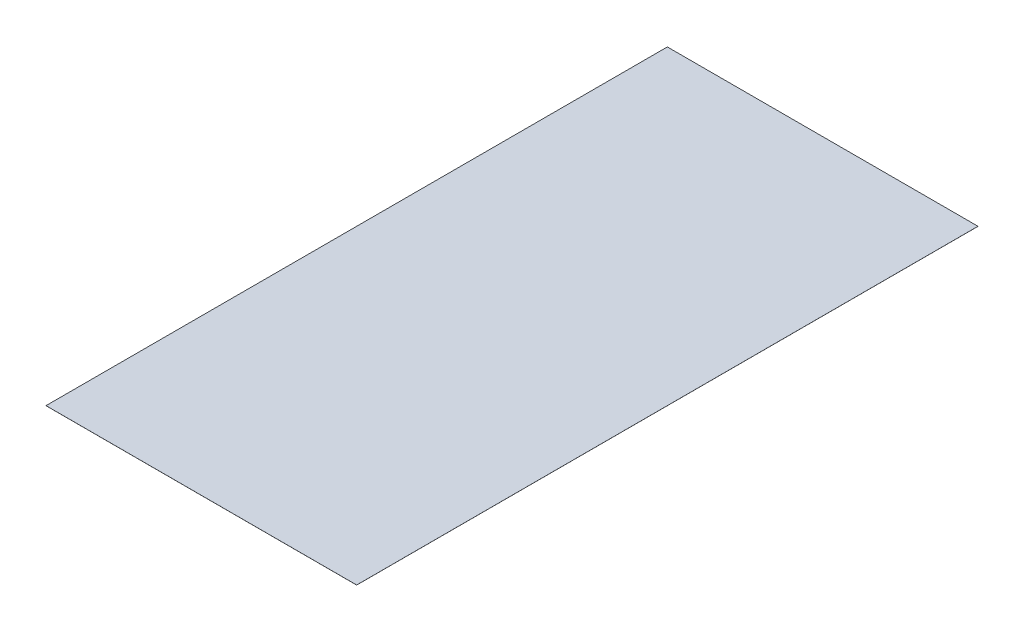
ISO-10303-21;
HEADER;
FILE_DESCRIPTION(('STEP AP214'),'2;1');
FILE_NAME('part.step','',(''),(''),'','','');
FILE_SCHEMA(('AUTOMOTIVE_DESIGN { 1 0 10303 214 1 1 1 1 }'));
ENDSEC;
DATA;
#1=APPLICATION_CONTEXT('core data for automotive mechanical design processes');
#2=APPLICATION_PROTOCOL_DEFINITION('international standard','automotive_design',2000,#1);
#3=PRODUCT_CONTEXT('',#1,'mechanical');
#4=PRODUCT('Part','Part','',(#3));
#5=PRODUCT_RELATED_PRODUCT_CATEGORY('part','',(#4));
#6=PRODUCT_DEFINITION_FORMATION('','',#4);
#7=PRODUCT_DEFINITION_CONTEXT('part definition',#1,'design');
#8=PRODUCT_DEFINITION('design','',#6,#7);
#9=PRODUCT_DEFINITION_SHAPE('','',#8);
#10=(LENGTH_UNIT() NAMED_UNIT(*) SI_UNIT(.MILLI.,.METRE.));
#11=(NAMED_UNIT(*) PLANE_ANGLE_UNIT() SI_UNIT($,.RADIAN.));
#12=(NAMED_UNIT(*) SI_UNIT($,.STERADIAN.) SOLID_ANGLE_UNIT());
#13=UNCERTAINTY_MEASURE_WITH_UNIT(LENGTH_MEASURE(1.E-05),#10,'distance_accuracy_value','');
#14=(GEOMETRIC_REPRESENTATION_CONTEXT(3) GLOBAL_UNCERTAINTY_ASSIGNED_CONTEXT((#13)) GLOBAL_UNIT_ASSIGNED_CONTEXT((#10,
#11,#12)) REPRESENTATION_CONTEXT('',''));
#15=CARTESIAN_POINT('',(0.,0.,0.));
#16=DIRECTION('',(0.,0.,1.));
#17=DIRECTION('',(1.,0.,0.));
#18=AXIS2_PLACEMENT_3D('',#15,#16,#17);
#19=CARTESIAN_POINT('',(2500.,1.,5000.));
#20=DIRECTION('',(-1.,0.,0.));
#21=DIRECTION('',(0.,0.,1.));
#22=AXIS2_PLACEMENT_3D('',#19,#20,#21);
#23=PLANE('',#22);
#24=DIRECTION('',(0.,0.,-1.));
#25=VECTOR('',#24,1.);
#26=CARTESIAN_POINT('',(2500.,0.,5000.));
#27=LINE('',#26,#25);
#28=CARTESIAN_POINT('',(2500.,0.,5000.));
#29=VERTEX_POINT('',#28);
#30=CARTESIAN_POINT('',(2500.,0.,-5000.));
#31=VERTEX_POINT('',#30);
#32=EDGE_CURVE('E98',#29,#31,#27,.T.);
#33=ORIENTED_EDGE('',*,*,#32,.T.);
#34=DIRECTION('',(0.,-1.,0.));
#35=VECTOR('',#34,1.);
#36=CARTESIAN_POINT('',(2500.,1.,-5000.));
#37=LINE('',#36,#35);
#38=CARTESIAN_POINT('',(2500.,1.,-5000.));
#39=VERTEX_POINT('',#38);
#40=EDGE_CURVE('E11',#39,#31,#37,.T.);
#41=ORIENTED_EDGE('',*,*,#40,.F.);
#42=DIRECTION('',(0.,0.,-1.));
#43=VECTOR('',#42,1.);
#44=CARTESIAN_POINT('',(2500.,1.,5000.));
#45=LINE('',#44,#43);
#46=CARTESIAN_POINT('',(2500.,1.,5000.));
#47=VERTEX_POINT('',#46);
#48=EDGE_CURVE('E86',#47,#39,#45,.T.);
#49=ORIENTED_EDGE('',*,*,#48,.F.);
#50=DIRECTION('',(0.,-1.,0.));
#51=VECTOR('',#50,1.);
#52=CARTESIAN_POINT('',(2500.,1.,5000.));
#53=LINE('',#52,#51);
#54=EDGE_CURVE('E94',#47,#29,#53,.T.);
#55=ORIENTED_EDGE('',*,*,#54,.T.);
#56=EDGE_LOOP('',(#33,#41,#49,#55));
#57=FACE_BOUND('',#56,.T.);
#58=ADVANCED_FACE('F35',(#57),#23,.F.);
#59=CARTESIAN_POINT('',(-2500.,1.,-5000.));
#60=DIRECTION('',(0.,0.,1.));
#61=DIRECTION('',(1.,0.,0.));
#62=AXIS2_PLACEMENT_3D('',#59,#60,#61);
#63=PLANE('',#62);
#64=DIRECTION('',(-1.,0.,0.));
#65=VECTOR('',#64,1.);
#66=CARTESIAN_POINT('',(-2500.,0.,-5000.));
#67=LINE('',#66,#65);
#68=CARTESIAN_POINT('',(-2500.,0.,-5000.));
#69=VERTEX_POINT('',#68);
#70=EDGE_CURVE('E90',#31,#69,#67,.T.);
#71=ORIENTED_EDGE('',*,*,#70,.T.);
#72=DIRECTION('',(0.,-1.,0.));
#73=VECTOR('',#72,1.);
#74=CARTESIAN_POINT('',(-2500.,1.,-5000.));
#75=LINE('',#74,#73);
#76=CARTESIAN_POINT('',(-2500.,1.,-5000.));
#77=VERTEX_POINT('',#76);
#78=EDGE_CURVE('E43',#77,#69,#75,.T.);
#79=ORIENTED_EDGE('',*,*,#78,.F.);
#80=DIRECTION('',(-1.,0.,0.));
#81=VECTOR('',#80,1.);
#82=CARTESIAN_POINT('',(-2500.,1.,-5000.));
#83=LINE('',#82,#81);
#84=EDGE_CURVE('E81',#39,#77,#83,.T.);
#85=ORIENTED_EDGE('',*,*,#84,.F.);
#86=ORIENTED_EDGE('',*,*,#40,.T.);
#87=EDGE_LOOP('',(#71,#79,#85,#86));
#88=FACE_BOUND('',#87,.T.);
#89=ADVANCED_FACE('F89',(#88),#63,.F.);
#90=CARTESIAN_POINT('',(-2500.,1.,5000.));
#91=DIRECTION('',(1.,0.,0.));
#92=DIRECTION('',(0.,0.,-1.));
#93=AXIS2_PLACEMENT_3D('',#90,#91,#92);
#94=PLANE('',#93);
#95=DIRECTION('',(0.,0.,1.));
#96=VECTOR('',#95,1.);
#97=CARTESIAN_POINT('',(-2500.,0.,5000.));
#98=LINE('',#97,#96);
#99=CARTESIAN_POINT('',(-2500.,0.,5000.));
#100=VERTEX_POINT('',#99);
#101=EDGE_CURVE('E68',#69,#100,#98,.T.);
#102=ORIENTED_EDGE('',*,*,#101,.T.);
#103=DIRECTION('',(0.,-1.,0.));
#104=VECTOR('',#103,1.);
#105=CARTESIAN_POINT('',(-2500.,1.,5000.));
#106=LINE('',#105,#104);
#107=CARTESIAN_POINT('',(-2500.,1.,5000.));
#108=VERTEX_POINT('',#107);
#109=EDGE_CURVE('E91',#108,#100,#106,.T.);
#110=ORIENTED_EDGE('',*,*,#109,.F.);
#111=DIRECTION('',(0.,0.,1.));
#112=VECTOR('',#111,1.);
#113=CARTESIAN_POINT('',(-2500.,1.,5000.));
#114=LINE('',#113,#112);
#115=EDGE_CURVE('E84',#77,#108,#114,.T.);
#116=ORIENTED_EDGE('',*,*,#115,.F.);
#117=ORIENTED_EDGE('',*,*,#78,.T.);
#118=EDGE_LOOP('',(#102,#110,#116,#117));
#119=FACE_BOUND('',#118,.T.);
#120=ADVANCED_FACE('F92',(#119),#94,.F.);
#121=CARTESIAN_POINT('',(-2500.,1.,5000.));
#122=DIRECTION('',(0.,0.,-1.));
#123=DIRECTION('',(-1.,0.,0.));
#124=AXIS2_PLACEMENT_3D('',#121,#122,#123);
#125=PLANE('',#124);
#126=DIRECTION('',(1.,0.,0.));
#127=VECTOR('',#126,1.);
#128=CARTESIAN_POINT('',(-2500.,0.,5000.));
#129=LINE('',#128,#127);
#130=EDGE_CURVE('E74',#100,#29,#129,.T.);
#131=ORIENTED_EDGE('',*,*,#130,.T.);
#132=ORIENTED_EDGE('',*,*,#54,.F.);
#133=DIRECTION('',(1.,0.,0.));
#134=VECTOR('',#133,1.);
#135=CARTESIAN_POINT('',(-2500.,1.,5000.));
#136=LINE('',#135,#134);
#137=EDGE_CURVE('E51',#108,#47,#136,.T.);
#138=ORIENTED_EDGE('',*,*,#137,.F.);
#139=ORIENTED_EDGE('',*,*,#109,.T.);
#140=EDGE_LOOP('',(#131,#132,#138,#139));
#141=FACE_BOUND('',#140,.T.);
#142=ADVANCED_FACE('F105',(#141),#125,.F.);
#143=CARTESIAN_POINT('',(0.,1.,0.));
#144=DIRECTION('',(0.,-1.,0.));
#145=DIRECTION('',(0.,0.,-1.));
#146=AXIS2_PLACEMENT_3D('',#143,#144,#145);
#147=PLANE('',#146);
#148=ORIENTED_EDGE('',*,*,#48,.T.);
#149=ORIENTED_EDGE('',*,*,#84,.T.);
#150=ORIENTED_EDGE('',*,*,#115,.T.);
#151=ORIENTED_EDGE('',*,*,#137,.T.);
#152=EDGE_LOOP('',(#148,#149,#150,#151));
#153=FACE_BOUND('',#152,.T.);
#154=ADVANCED_FACE('F82',(#153),#147,.F.);
#155=CARTESIAN_POINT('',(0.,0.,0.));
#156=DIRECTION('',(0.,-1.,0.));
#157=DIRECTION('',(0.,0.,-1.));
#158=AXIS2_PLACEMENT_3D('',#155,#156,#157);
#159=PLANE('',#158);
#160=ORIENTED_EDGE('',*,*,#32,.F.);
#161=ORIENTED_EDGE('',*,*,#130,.F.);
#162=ORIENTED_EDGE('',*,*,#101,.F.);
#163=ORIENTED_EDGE('',*,*,#70,.F.);
#164=EDGE_LOOP('',(#160,#161,#162,#163));
#165=FACE_BOUND('',#164,.T.);
#166=ADVANCED_FACE('F108',(#165),#159,.T.);
#167=CLOSED_SHELL('',(#58,#89,#120,#142,#154,#166));
#168=MANIFOLD_SOLID_BREP('B2',#167);
#169=ADVANCED_BREP_SHAPE_REPRESENTATION('',(#18,#168),#14);
#170=SHAPE_DEFINITION_REPRESENTATION(#9,#169);
ENDSEC;
END-ISO-10303-21;
